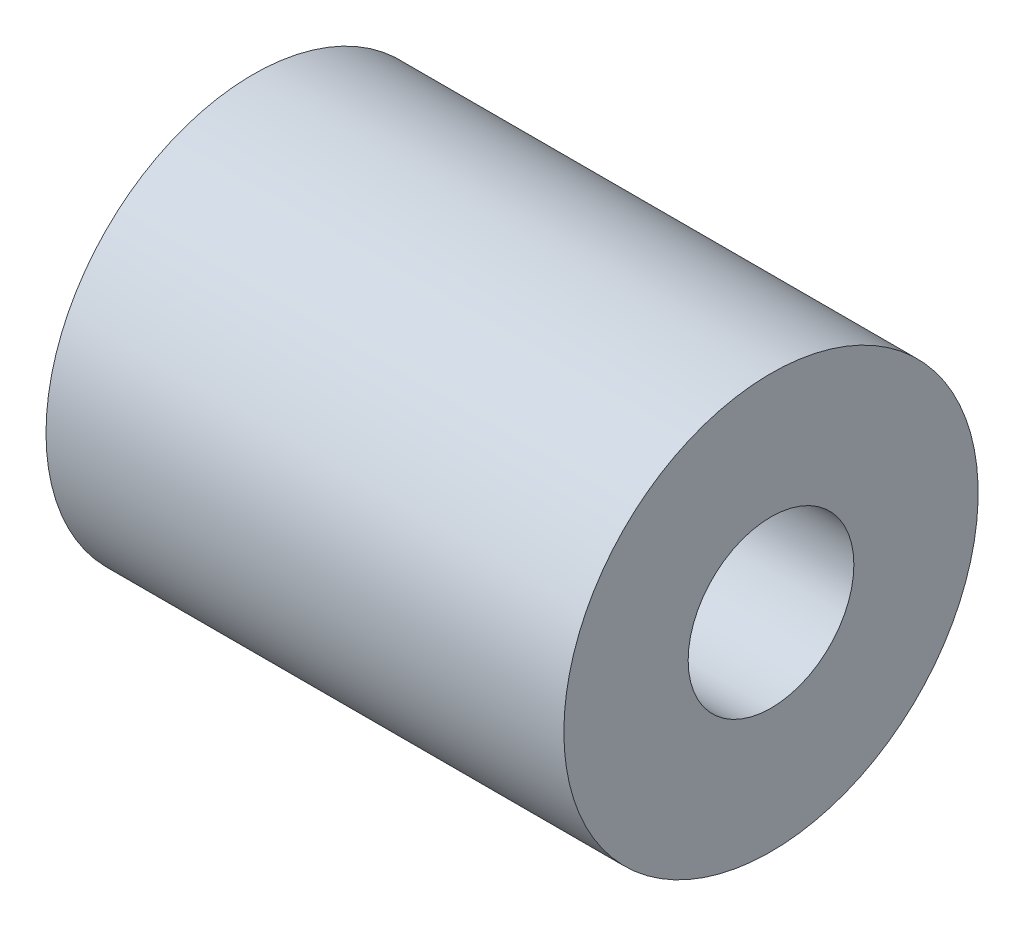
ISO-10303-21;
HEADER;
FILE_DESCRIPTION(('STEP AP214'),'2;1');
FILE_NAME('part.step','',(''),(''),'','','');
FILE_SCHEMA(('AUTOMOTIVE_DESIGN { 1 0 10303 214 1 1 1 1 }'));
ENDSEC;
DATA;
#1=APPLICATION_CONTEXT('core data for automotive mechanical design processes');
#2=APPLICATION_PROTOCOL_DEFINITION('international standard','automotive_design',2000,#1);
#3=PRODUCT_CONTEXT('',#1,'mechanical');
#4=PRODUCT('Part','Part','',(#3));
#5=PRODUCT_RELATED_PRODUCT_CATEGORY('part','',(#4));
#6=PRODUCT_DEFINITION_FORMATION('','',#4);
#7=PRODUCT_DEFINITION_CONTEXT('part definition',#1,'design');
#8=PRODUCT_DEFINITION('design','',#6,#7);
#9=PRODUCT_DEFINITION_SHAPE('','',#8);
#10=(LENGTH_UNIT() NAMED_UNIT(*) SI_UNIT(.MILLI.,.METRE.));
#11=(NAMED_UNIT(*) PLANE_ANGLE_UNIT() SI_UNIT($,.RADIAN.));
#12=(NAMED_UNIT(*) SI_UNIT($,.STERADIAN.) SOLID_ANGLE_UNIT());
#13=UNCERTAINTY_MEASURE_WITH_UNIT(LENGTH_MEASURE(1.E-05),#10,'distance_accuracy_value','');
#14=(GEOMETRIC_REPRESENTATION_CONTEXT(3) GLOBAL_UNCERTAINTY_ASSIGNED_CONTEXT((#13)) GLOBAL_UNIT_ASSIGNED_CONTEXT((#10,
#11,#12)) REPRESENTATION_CONTEXT('',''));
#15=CARTESIAN_POINT('',(0.,0.,0.));
#16=DIRECTION('',(0.,0.,1.));
#17=DIRECTION('',(1.,0.,0.));
#18=AXIS2_PLACEMENT_3D('',#15,#16,#17);
#19=CARTESIAN_POINT('',(-12.5,10.,0.));
#20=DIRECTION('',(1.,0.,0.));
#21=DIRECTION('',(0.,0.,-1.));
#22=AXIS2_PLACEMENT_3D('',#19,#20,#21);
#23=PLANE('',#22);
#24=CARTESIAN_POINT('',(-12.5,0.,0.));
#25=DIRECTION('',(1.,0.,0.));
#26=DIRECTION('',(0.,0.,-1.));
#27=AXIS2_PLACEMENT_3D('',#24,#25,#26);
#28=CIRCLE('',#27,4.);
#29=CARTESIAN_POINT('',(-12.5,0.,-4.));
#30=VERTEX_POINT('',#29);
#31=EDGE_CURVE('E55',#30,#30,#28,.T.);
#32=ORIENTED_EDGE('',*,*,#31,.T.);
#33=EDGE_LOOP('',(#32));
#34=FACE_BOUND('',#33,.T.);
#35=CARTESIAN_POINT('',(-12.5,0.,0.));
#36=DIRECTION('',(-1.,0.,0.));
#37=DIRECTION('',(0.,0.,1.));
#38=AXIS2_PLACEMENT_3D('',#35,#36,#37);
#39=CIRCLE('',#38,10.);
#40=CARTESIAN_POINT('',(-12.5,0.,10.));
#41=VERTEX_POINT('',#40);
#42=EDGE_CURVE('E41',#41,#41,#39,.T.);
#43=ORIENTED_EDGE('',*,*,#42,.T.);
#44=EDGE_LOOP('',(#43));
#45=FACE_BOUND('',#44,.T.);
#46=ADVANCED_FACE('F35',(#34,#45),#23,.F.);
#47=CARTESIAN_POINT('',(12.5,10.,0.));
#48=DIRECTION('',(-1.,0.,0.));
#49=DIRECTION('',(0.,0.,1.));
#50=AXIS2_PLACEMENT_3D('',#47,#48,#49);
#51=PLANE('',#50);
#52=CARTESIAN_POINT('',(12.5,0.,0.));
#53=DIRECTION('',(1.,0.,0.));
#54=DIRECTION('',(0.,0.,-1.));
#55=AXIS2_PLACEMENT_3D('',#52,#53,#54);
#56=CIRCLE('',#55,4.);
#57=CARTESIAN_POINT('',(12.5,0.,-4.));
#58=VERTEX_POINT('',#57);
#59=EDGE_CURVE('E49',#58,#58,#56,.T.);
#60=ORIENTED_EDGE('',*,*,#59,.F.);
#61=EDGE_LOOP('',(#60));
#62=FACE_BOUND('',#61,.T.);
#63=CARTESIAN_POINT('',(12.5,0.,0.));
#64=DIRECTION('',(-1.,0.,0.));
#65=DIRECTION('',(0.,0.,1.));
#66=AXIS2_PLACEMENT_3D('',#63,#64,#65);
#67=CIRCLE('',#66,10.);
#68=CARTESIAN_POINT('',(12.5,0.,10.));
#69=VERTEX_POINT('',#68);
#70=EDGE_CURVE('E10',#69,#69,#67,.T.);
#71=ORIENTED_EDGE('',*,*,#70,.F.);
#72=EDGE_LOOP('',(#71));
#73=FACE_BOUND('',#72,.T.);
#74=ADVANCED_FACE('F73',(#62,#73),#51,.F.);
#75=CARTESIAN_POINT('',(-12.5,0.,0.));
#76=DIRECTION('',(-1.,0.,0.));
#77=DIRECTION('',(0.,0.,1.));
#78=AXIS2_PLACEMENT_3D('',#75,#76,#77);
#79=CYLINDRICAL_SURFACE('',#78,10.);
#80=ORIENTED_EDGE('',*,*,#42,.F.);
#81=EDGE_LOOP('',(#80));
#82=FACE_BOUND('',#81,.T.);
#83=ORIENTED_EDGE('',*,*,#70,.T.);
#84=EDGE_LOOP('',(#83));
#85=FACE_BOUND('',#84,.T.);
#86=ADVANCED_FACE('F78',(#82,#85),#79,.T.);
#87=CARTESIAN_POINT('',(4.,0.,0.));
#88=DIRECTION('',(1.,0.,0.));
#89=DIRECTION('',(0.,0.,-1.));
#90=AXIS2_PLACEMENT_3D('',#87,#88,#89);
#91=CYLINDRICAL_SURFACE('',#90,4.);
#92=CARTESIAN_POINT('',(4.,0.,0.));
#93=DIRECTION('',(1.,0.,0.));
#94=DIRECTION('',(0.,0.,-1.));
#95=AXIS2_PLACEMENT_3D('',#92,#93,#94);
#96=CIRCLE('',#95,4.);
#97=CARTESIAN_POINT('',(4.,0.,-4.));
#98=VERTEX_POINT('',#97);
#99=EDGE_CURVE('E45',#98,#98,#96,.T.);
#100=ORIENTED_EDGE('',*,*,#99,.F.);
#101=EDGE_LOOP('',(#100));
#102=FACE_BOUND('',#101,.T.);
#103=ORIENTED_EDGE('',*,*,#59,.T.);
#104=EDGE_LOOP('',(#103));
#105=FACE_BOUND('',#104,.T.);
#106=ADVANCED_FACE('F84',(#102,#105),#91,.F.);
#107=CARTESIAN_POINT('',(4.,0.,0.));
#108=DIRECTION('',(1.,0.,0.));
#109=DIRECTION('',(0.,0.,-1.));
#110=AXIS2_PLACEMENT_3D('',#107,#108,#109);
#111=PLANE('',#110);
#112=ORIENTED_EDGE('',*,*,#99,.T.);
#113=EDGE_LOOP('',(#112));
#114=FACE_BOUND('',#113,.T.);
#115=ADVANCED_FACE('F70',(#114),#111,.T.);
#116=CARTESIAN_POINT('',(-4.,0.,0.));
#117=DIRECTION('',(-1.,0.,0.));
#118=DIRECTION('',(0.,0.,1.));
#119=AXIS2_PLACEMENT_3D('',#116,#117,#118);
#120=CYLINDRICAL_SURFACE('',#119,4.);
#121=CARTESIAN_POINT('',(-4.,0.,0.));
#122=DIRECTION('',(1.,0.,0.));
#123=DIRECTION('',(0.,0.,-1.));
#124=AXIS2_PLACEMENT_3D('',#121,#122,#123);
#125=CIRCLE('',#124,4.);
#126=CARTESIAN_POINT('',(-4.,0.,-4.));
#127=VERTEX_POINT('',#126);
#128=EDGE_CURVE('E53',#127,#127,#125,.T.);
#129=ORIENTED_EDGE('',*,*,#128,.T.);
#130=EDGE_LOOP('',(#129));
#131=FACE_BOUND('',#130,.T.);
#132=ORIENTED_EDGE('',*,*,#31,.F.);
#133=EDGE_LOOP('',(#132));
#134=FACE_BOUND('',#133,.T.);
#135=ADVANCED_FACE('F61',(#131,#134),#120,.F.);
#136=CARTESIAN_POINT('',(-4.,0.,0.));
#137=DIRECTION('',(-1.,0.,0.));
#138=DIRECTION('',(0.,0.,-1.));
#139=AXIS2_PLACEMENT_3D('',#136,#137,#138);
#140=PLANE('',#139);
#141=ORIENTED_EDGE('',*,*,#128,.F.);
#142=EDGE_LOOP('',(#141));
#143=FACE_BOUND('',#142,.T.);
#144=ADVANCED_FACE('F64',(#143),#140,.T.);
#145=CLOSED_SHELL('',(#46,#74,#86,#106,#115,#135,#144));
#146=MANIFOLD_SOLID_BREP('B2',#145);
#147=ADVANCED_BREP_SHAPE_REPRESENTATION('',(#18,#146),#14);
#148=SHAPE_DEFINITION_REPRESENTATION(#9,#147);
ENDSEC;
END-ISO-10303-21;
